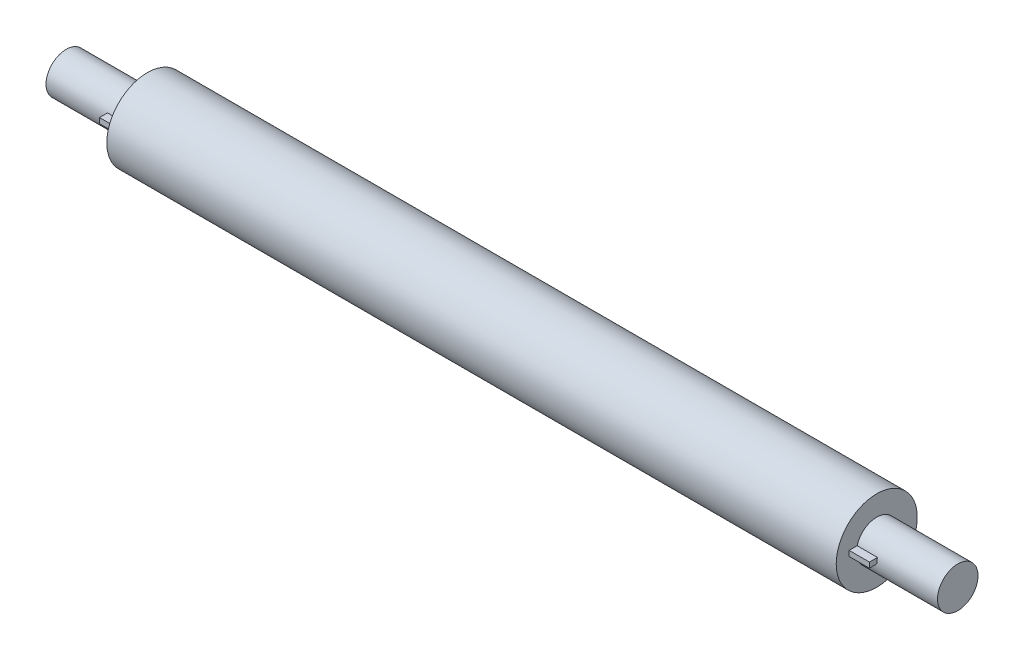
ISO-10303-21;
HEADER;
FILE_DESCRIPTION(('STEP AP214'),'2;1');
FILE_NAME('part.step','',(''),(''),'','','');
FILE_SCHEMA(('AUTOMOTIVE_DESIGN { 1 0 10303 214 1 1 1 1 }'));
ENDSEC;
DATA;
#1=APPLICATION_CONTEXT('core data for automotive mechanical design processes');
#2=APPLICATION_PROTOCOL_DEFINITION('international standard','automotive_design',2000,#1);
#3=PRODUCT_CONTEXT('',#1,'mechanical');
#4=PRODUCT('Part','Part','',(#3));
#5=PRODUCT_RELATED_PRODUCT_CATEGORY('part','',(#4));
#6=PRODUCT_DEFINITION_FORMATION('','',#4);
#7=PRODUCT_DEFINITION_CONTEXT('part definition',#1,'design');
#8=PRODUCT_DEFINITION('design','',#6,#7);
#9=PRODUCT_DEFINITION_SHAPE('','',#8);
#10=(LENGTH_UNIT() NAMED_UNIT(*) SI_UNIT(.MILLI.,.METRE.));
#11=(NAMED_UNIT(*) PLANE_ANGLE_UNIT() SI_UNIT($,.RADIAN.));
#12=(NAMED_UNIT(*) SI_UNIT($,.STERADIAN.) SOLID_ANGLE_UNIT());
#13=UNCERTAINTY_MEASURE_WITH_UNIT(LENGTH_MEASURE(1.E-05),#10,'distance_accuracy_value','');
#14=(GEOMETRIC_REPRESENTATION_CONTEXT(3) GLOBAL_UNCERTAINTY_ASSIGNED_CONTEXT((#13)) GLOBAL_UNIT_ASSIGNED_CONTEXT((#10,
#11,#12)) REPRESENTATION_CONTEXT('',''));
#15=CARTESIAN_POINT('',(0.,0.,0.));
#16=DIRECTION('',(0.,0.,1.));
#17=DIRECTION('',(1.,0.,0.));
#18=AXIS2_PLACEMENT_3D('',#15,#16,#17);
#19=CARTESIAN_POINT('',(90.,0.,5.));
#20=DIRECTION('',(1.,0.,0.));
#21=DIRECTION('',(0.,0.,-1.));
#22=AXIS2_PLACEMENT_3D('',#19,#20,#21);
#23=PLANE('',#22);
#24=CARTESIAN_POINT('',(90.,0.,0.));
#25=DIRECTION('',(-1.,0.,0.));
#26=DIRECTION('',(0.,0.,1.));
#27=AXIS2_PLACEMENT_3D('',#24,#25,#26);
#28=CIRCLE('',#27,10.);
#29=CARTESIAN_POINT('',(90.,0.,10.));
#30=VERTEX_POINT('',#29);
#31=EDGE_CURVE('E160',#30,#30,#28,.T.);
#32=ORIENTED_EDGE('',*,*,#31,.F.);
#33=EDGE_LOOP('',(#32));
#34=FACE_BOUND('',#33,.T.);
#35=DIRECTION('',(0.,-1.,0.));
#36=VECTOR('',#35,1.);
#37=CARTESIAN_POINT('',(90.,0.,6.80934893862651));
#38=LINE('',#37,#36);
#39=CARTESIAN_POINT('',(90.,1.30775575642559,6.80934893862651));
#40=VERTEX_POINT('',#39);
#41=CARTESIAN_POINT('',(90.,0.,6.80934893862651));
#42=VERTEX_POINT('',#41);
#43=EDGE_CURVE('E145',#40,#42,#38,.T.);
#44=ORIENTED_EDGE('',*,*,#43,.F.);
#45=DIRECTION('',(0.,0.,1.));
#46=VECTOR('',#45,1.);
#47=CARTESIAN_POINT('',(90.,1.30775575642559,6.80934893862651));
#48=LINE('',#47,#46);
#49=CARTESIAN_POINT('',(90.,1.30775575642559,4.82594808110652));
#50=VERTEX_POINT('',#49);
#51=EDGE_CURVE('E130',#50,#40,#48,.T.);
#52=ORIENTED_EDGE('',*,*,#51,.F.);
#53=CARTESIAN_POINT('',(90.,0.,0.));
#54=DIRECTION('',(-1.,0.,0.));
#55=DIRECTION('',(0.,0.,1.));
#56=AXIS2_PLACEMENT_3D('',#53,#54,#55);
#57=CIRCLE('',#56,5.);
#58=CARTESIAN_POINT('',(90.,0.,5.));
#59=VERTEX_POINT('',#58);
#60=EDGE_CURVE('E11',#50,#59,#57,.T.);
#61=ORIENTED_EDGE('',*,*,#60,.T.);
#62=DIRECTION('',(0.,0.,-1.));
#63=VECTOR('',#62,1.);
#64=CARTESIAN_POINT('',(90.,0.,5.));
#65=LINE('',#64,#63);
#66=EDGE_CURVE('E135',#42,#59,#65,.T.);
#67=ORIENTED_EDGE('',*,*,#66,.F.);
#68=EDGE_LOOP('',(#44,#52,#61,#67));
#69=FACE_BOUND('',#68,.T.);
#70=ADVANCED_FACE('F32',(#34,#69),#23,.T.);
#71=CARTESIAN_POINT('',(-110.,0.,0.));
#72=DIRECTION('',(-1.,0.,0.));
#73=DIRECTION('',(0.,0.,1.));
#74=AXIS2_PLACEMENT_3D('',#71,#72,#73);
#75=CYLINDRICAL_SURFACE('',#74,5.);
#76=CARTESIAN_POINT('',(110.,0.,0.));
#77=DIRECTION('',(-1.,0.,0.));
#78=DIRECTION('',(0.,0.,1.));
#79=AXIS2_PLACEMENT_3D('',#76,#77,#78);
#80=CIRCLE('',#79,5.);
#81=CARTESIAN_POINT('',(110.,0.,5.));
#82=VERTEX_POINT('',#81);
#83=EDGE_CURVE('E39',#82,#82,#80,.T.);
#84=ORIENTED_EDGE('',*,*,#83,.T.);
#85=EDGE_LOOP('',(#84));
#86=FACE_BOUND('',#85,.T.);
#87=ORIENTED_EDGE('',*,*,#60,.F.);
#88=DIRECTION('',(-1.,0.,0.));
#89=VECTOR('',#88,1.);
#90=CARTESIAN_POINT('',(95.,1.30775575642559,4.82594808110652));
#91=LINE('',#90,#89);
#92=CARTESIAN_POINT('',(95.,1.30775575642559,4.82594808110652));
#93=VERTEX_POINT('',#92);
#94=EDGE_CURVE('E157',#93,#50,#91,.T.);
#95=ORIENTED_EDGE('',*,*,#94,.F.);
#96=CARTESIAN_POINT('',(95.,0.,0.));
#97=DIRECTION('',(-1.,0.,0.));
#98=DIRECTION('',(0.,0.,-1.));
#99=AXIS2_PLACEMENT_3D('',#96,#97,#98);
#100=CIRCLE('',#99,5.);
#101=CARTESIAN_POINT('',(95.,0.,5.));
#102=VERTEX_POINT('',#101);
#103=EDGE_CURVE('E131',#102,#93,#100,.T.);
#104=ORIENTED_EDGE('',*,*,#103,.F.);
#105=DIRECTION('',(-1.,0.,0.));
#106=VECTOR('',#105,1.);
#107=CARTESIAN_POINT('',(95.,0.,5.));
#108=LINE('',#107,#106);
#109=EDGE_CURVE('E142',#102,#59,#108,.T.);
#110=ORIENTED_EDGE('',*,*,#109,.T.);
#111=EDGE_LOOP('',(#87,#95,#104,#110));
#112=FACE_BOUND('',#111,.T.);
#113=ADVANCED_FACE('F173',(#86,#112),#75,.T.);
#114=CARTESIAN_POINT('',(110.,0.,0.));
#115=DIRECTION('',(1.,0.,0.));
#116=DIRECTION('',(0.,0.,-1.));
#117=AXIS2_PLACEMENT_3D('',#114,#115,#116);
#118=PLANE('',#117);
#119=ORIENTED_EDGE('',*,*,#83,.F.);
#120=EDGE_LOOP('',(#119));
#121=FACE_BOUND('',#120,.T.);
#122=ADVANCED_FACE('F176',(#121),#118,.T.);
#123=CARTESIAN_POINT('',(-110.,0.,0.));
#124=DIRECTION('',(-1.,0.,0.));
#125=DIRECTION('',(0.,0.,1.));
#126=AXIS2_PLACEMENT_3D('',#123,#124,#125);
#127=PLANE('',#126);
#128=CARTESIAN_POINT('',(-110.,0.,0.));
#129=DIRECTION('',(-1.,0.,0.));
#130=DIRECTION('',(0.,0.,1.));
#131=AXIS2_PLACEMENT_3D('',#128,#129,#130);
#132=CIRCLE('',#131,5.);
#133=CARTESIAN_POINT('',(-110.,0.,5.));
#134=VERTEX_POINT('',#133);
#135=EDGE_CURVE('E168',#134,#134,#132,.T.);
#136=ORIENTED_EDGE('',*,*,#135,.T.);
#137=EDGE_LOOP('',(#136));
#138=FACE_BOUND('',#137,.T.);
#139=ADVANCED_FACE('F178',(#138),#127,.T.);
#140=CARTESIAN_POINT('',(-110.,0.,0.));
#141=DIRECTION('',(-1.,0.,0.));
#142=DIRECTION('',(0.,0.,1.));
#143=AXIS2_PLACEMENT_3D('',#140,#141,#142);
#144=CYLINDRICAL_SURFACE('',#143,5.);
#145=DIRECTION('',(1.,0.,0.));
#146=VECTOR('',#145,1.);
#147=CARTESIAN_POINT('',(-95.,0.,5.));
#148=LINE('',#147,#146);
#149=CARTESIAN_POINT('',(-95.,0.,5.));
#150=VERTEX_POINT('',#149);
#151=CARTESIAN_POINT('',(-90.,0.,5.));
#152=VERTEX_POINT('',#151);
#153=EDGE_CURVE('E46',#150,#152,#148,.T.);
#154=ORIENTED_EDGE('',*,*,#153,.F.);
#155=CARTESIAN_POINT('',(-95.,0.,0.));
#156=DIRECTION('',(-1.,0.,0.));
#157=DIRECTION('',(0.,0.,-1.));
#158=AXIS2_PLACEMENT_3D('',#155,#156,#157);
#159=CIRCLE('',#158,5.);
#160=CARTESIAN_POINT('',(-95.,1.30775575642559,4.82594808110653));
#161=VERTEX_POINT('',#160);
#162=EDGE_CURVE('E50',#150,#161,#159,.T.);
#163=ORIENTED_EDGE('',*,*,#162,.T.);
#164=DIRECTION('',(1.,0.,0.));
#165=VECTOR('',#164,1.);
#166=CARTESIAN_POINT('',(-95.,1.30775575642559,4.82594808110652));
#167=LINE('',#166,#165);
#168=CARTESIAN_POINT('',(-90.,1.30775575642559,4.82594808110652));
#169=VERTEX_POINT('',#168);
#170=EDGE_CURVE('E118',#161,#169,#167,.T.);
#171=ORIENTED_EDGE('',*,*,#170,.T.);
#172=CARTESIAN_POINT('',(-90.,0.,0.));
#173=DIRECTION('',(-1.,0.,0.));
#174=DIRECTION('',(0.,0.,1.));
#175=AXIS2_PLACEMENT_3D('',#172,#173,#174);
#176=CIRCLE('',#175,5.);
#177=EDGE_CURVE('E166',#169,#152,#176,.T.);
#178=ORIENTED_EDGE('',*,*,#177,.T.);
#179=EDGE_LOOP('',(#154,#163,#171,#178));
#180=FACE_BOUND('',#179,.T.);
#181=ORIENTED_EDGE('',*,*,#135,.F.);
#182=EDGE_LOOP('',(#181));
#183=FACE_BOUND('',#182,.T.);
#184=ADVANCED_FACE('F184',(#180,#183),#144,.T.);
#185=CARTESIAN_POINT('',(-90.,0.,5.));
#186=DIRECTION('',(-1.,0.,0.));
#187=DIRECTION('',(0.,0.,1.));
#188=AXIS2_PLACEMENT_3D('',#185,#186,#187);
#189=PLANE('',#188);
#190=DIRECTION('',(0.,0.,-1.));
#191=VECTOR('',#190,1.);
#192=CARTESIAN_POINT('',(-90.,0.,5.));
#193=LINE('',#192,#191);
#194=CARTESIAN_POINT('',(-90.,0.,6.80934893862651));
#195=VERTEX_POINT('',#194);
#196=EDGE_CURVE('E101',#195,#152,#193,.T.);
#197=ORIENTED_EDGE('',*,*,#196,.T.);
#198=ORIENTED_EDGE('',*,*,#177,.F.);
#199=DIRECTION('',(0.,0.,1.));
#200=VECTOR('',#199,1.);
#201=CARTESIAN_POINT('',(-90.,1.30775575642559,6.80934893862651));
#202=LINE('',#201,#200);
#203=CARTESIAN_POINT('',(-90.,1.30775575642559,6.80934893862651));
#204=VERTEX_POINT('',#203);
#205=EDGE_CURVE('E125',#169,#204,#202,.T.);
#206=ORIENTED_EDGE('',*,*,#205,.T.);
#207=DIRECTION('',(0.,-1.,0.));
#208=VECTOR('',#207,1.);
#209=CARTESIAN_POINT('',(-90.,0.,6.80934893862651));
#210=LINE('',#209,#208);
#211=EDGE_CURVE('E123',#204,#195,#210,.T.);
#212=ORIENTED_EDGE('',*,*,#211,.T.);
#213=EDGE_LOOP('',(#197,#198,#206,#212));
#214=FACE_BOUND('',#213,.T.);
#215=CARTESIAN_POINT('',(-90.,0.,0.));
#216=DIRECTION('',(-1.,0.,0.));
#217=DIRECTION('',(0.,0.,1.));
#218=AXIS2_PLACEMENT_3D('',#215,#216,#217);
#219=CIRCLE('',#218,10.);
#220=CARTESIAN_POINT('',(-90.,0.,10.));
#221=VERTEX_POINT('',#220);
#222=EDGE_CURVE('E163',#221,#221,#219,.T.);
#223=ORIENTED_EDGE('',*,*,#222,.T.);
#224=EDGE_LOOP('',(#223));
#225=FACE_BOUND('',#224,.T.);
#226=ADVANCED_FACE('F223',(#214,#225),#189,.T.);
#227=CARTESIAN_POINT('',(-110.,0.,0.));
#228=DIRECTION('',(-1.,0.,0.));
#229=DIRECTION('',(0.,0.,1.));
#230=AXIS2_PLACEMENT_3D('',#227,#228,#229);
#231=CYLINDRICAL_SURFACE('',#230,10.);
#232=ORIENTED_EDGE('',*,*,#31,.T.);
#233=EDGE_LOOP('',(#232));
#234=FACE_BOUND('',#233,.T.);
#235=ORIENTED_EDGE('',*,*,#222,.F.);
#236=EDGE_LOOP('',(#235));
#237=FACE_BOUND('',#236,.T.);
#238=ADVANCED_FACE('F220',(#234,#237),#231,.T.);
#239=CARTESIAN_POINT('',(95.,1.30775575642559,6.80934893862651));
#240=DIRECTION('',(0.,-1.,0.));
#241=DIRECTION('',(0.,0.,-1.));
#242=AXIS2_PLACEMENT_3D('',#239,#240,#241);
#243=PLANE('',#242);
#244=ORIENTED_EDGE('',*,*,#51,.T.);
#245=DIRECTION('',(-1.,0.,0.));
#246=VECTOR('',#245,1.);
#247=CARTESIAN_POINT('',(95.,1.30775575642559,6.80934893862651));
#248=LINE('',#247,#246);
#249=CARTESIAN_POINT('',(95.,1.30775575642559,6.80934893862651));
#250=VERTEX_POINT('',#249);
#251=EDGE_CURVE('E154',#250,#40,#248,.T.);
#252=ORIENTED_EDGE('',*,*,#251,.F.);
#253=DIRECTION('',(0.,0.,1.));
#254=VECTOR('',#253,1.);
#255=CARTESIAN_POINT('',(95.,1.30775575642559,6.80934893862651));
#256=LINE('',#255,#254);
#257=EDGE_CURVE('E134',#93,#250,#256,.T.);
#258=ORIENTED_EDGE('',*,*,#257,.F.);
#259=ORIENTED_EDGE('',*,*,#94,.T.);
#260=EDGE_LOOP('',(#244,#252,#258,#259));
#261=FACE_BOUND('',#260,.T.);
#262=ADVANCED_FACE('F198',(#261),#243,.F.);
#263=CARTESIAN_POINT('',(95.,0.,6.80934893862651));
#264=DIRECTION('',(0.,0.,-1.));
#265=DIRECTION('',(-1.,0.,0.));
#266=AXIS2_PLACEMENT_3D('',#263,#264,#265);
#267=PLANE('',#266);
#268=ORIENTED_EDGE('',*,*,#43,.T.);
#269=DIRECTION('',(-1.,0.,0.));
#270=VECTOR('',#269,1.);
#271=CARTESIAN_POINT('',(95.,0.,6.80934893862651));
#272=LINE('',#271,#270);
#273=CARTESIAN_POINT('',(95.,0.,6.80934893862651));
#274=VERTEX_POINT('',#273);
#275=EDGE_CURVE('E151',#274,#42,#272,.T.);
#276=ORIENTED_EDGE('',*,*,#275,.F.);
#277=DIRECTION('',(0.,-1.,0.));
#278=VECTOR('',#277,1.);
#279=CARTESIAN_POINT('',(95.,0.,6.80934893862651));
#280=LINE('',#279,#278);
#281=EDGE_CURVE('E137',#250,#274,#280,.T.);
#282=ORIENTED_EDGE('',*,*,#281,.F.);
#283=ORIENTED_EDGE('',*,*,#251,.T.);
#284=EDGE_LOOP('',(#268,#276,#282,#283));
#285=FACE_BOUND('',#284,.T.);
#286=ADVANCED_FACE('F201',(#285),#267,.F.);
#287=CARTESIAN_POINT('',(95.,0.,5.));
#288=DIRECTION('',(0.,1.,0.));
#289=DIRECTION('',(0.,0.,1.));
#290=AXIS2_PLACEMENT_3D('',#287,#288,#289);
#291=PLANE('',#290);
#292=ORIENTED_EDGE('',*,*,#66,.T.);
#293=ORIENTED_EDGE('',*,*,#109,.F.);
#294=DIRECTION('',(0.,0.,-1.));
#295=VECTOR('',#294,1.);
#296=CARTESIAN_POINT('',(95.,0.,5.));
#297=LINE('',#296,#295);
#298=EDGE_CURVE('E139',#274,#102,#297,.T.);
#299=ORIENTED_EDGE('',*,*,#298,.F.);
#300=ORIENTED_EDGE('',*,*,#275,.T.);
#301=EDGE_LOOP('',(#292,#293,#299,#300));
#302=FACE_BOUND('',#301,.T.);
#303=ADVANCED_FACE('F207',(#302),#291,.F.);
#304=CARTESIAN_POINT('',(95.,0.,0.));
#305=DIRECTION('',(1.,0.,0.));
#306=DIRECTION('',(0.,0.,-1.));
#307=AXIS2_PLACEMENT_3D('',#304,#305,#306);
#308=PLANE('',#307);
#309=ORIENTED_EDGE('',*,*,#103,.T.);
#310=ORIENTED_EDGE('',*,*,#257,.T.);
#311=ORIENTED_EDGE('',*,*,#281,.T.);
#312=ORIENTED_EDGE('',*,*,#298,.T.);
#313=EDGE_LOOP('',(#309,#310,#311,#312));
#314=FACE_BOUND('',#313,.T.);
#315=ADVANCED_FACE('F204',(#314),#308,.T.);
#316=CARTESIAN_POINT('',(-95.,0.,5.));
#317=DIRECTION('',(0.,-1.,0.));
#318=DIRECTION('',(0.,0.,-1.));
#319=AXIS2_PLACEMENT_3D('',#316,#317,#318);
#320=PLANE('',#319);
#321=ORIENTED_EDGE('',*,*,#196,.F.);
#322=DIRECTION('',(1.,0.,0.));
#323=VECTOR('',#322,1.);
#324=CARTESIAN_POINT('',(-95.,0.,6.80934893862651));
#325=LINE('',#324,#323);
#326=CARTESIAN_POINT('',(-95.,0.,6.80934893862651));
#327=VERTEX_POINT('',#326);
#328=EDGE_CURVE('E97',#327,#195,#325,.T.);
#329=ORIENTED_EDGE('',*,*,#328,.F.);
#330=DIRECTION('',(0.,0.,-1.));
#331=VECTOR('',#330,1.);
#332=CARTESIAN_POINT('',(-95.,0.,5.));
#333=LINE('',#332,#331);
#334=EDGE_CURVE('E100',#327,#150,#333,.T.);
#335=ORIENTED_EDGE('',*,*,#334,.T.);
#336=ORIENTED_EDGE('',*,*,#153,.T.);
#337=EDGE_LOOP('',(#321,#329,#335,#336));
#338=FACE_BOUND('',#337,.T.);
#339=ADVANCED_FACE('F99',(#338),#320,.T.);
#340=CARTESIAN_POINT('',(-95.,0.,6.80934893862651));
#341=DIRECTION('',(0.,0.,1.));
#342=DIRECTION('',(1.,0.,0.));
#343=AXIS2_PLACEMENT_3D('',#340,#341,#342);
#344=PLANE('',#343);
#345=ORIENTED_EDGE('',*,*,#211,.F.);
#346=DIRECTION('',(1.,0.,0.));
#347=VECTOR('',#346,1.);
#348=CARTESIAN_POINT('',(-95.,1.30775575642559,6.80934893862651));
#349=LINE('',#348,#347);
#350=CARTESIAN_POINT('',(-95.,1.30775575642559,6.80934893862651));
#351=VERTEX_POINT('',#350);
#352=EDGE_CURVE('E105',#351,#204,#349,.T.);
#353=ORIENTED_EDGE('',*,*,#352,.F.);
#354=DIRECTION('',(0.,-1.,0.));
#355=VECTOR('',#354,1.);
#356=CARTESIAN_POINT('',(-95.,0.,6.80934893862651));
#357=LINE('',#356,#355);
#358=EDGE_CURVE('E111',#351,#327,#357,.T.);
#359=ORIENTED_EDGE('',*,*,#358,.T.);
#360=ORIENTED_EDGE('',*,*,#328,.T.);
#361=EDGE_LOOP('',(#345,#353,#359,#360));
#362=FACE_BOUND('',#361,.T.);
#363=ADVANCED_FACE('F114',(#362),#344,.T.);
#364=CARTESIAN_POINT('',(-95.,1.30775575642559,6.80934893862651));
#365=DIRECTION('',(0.,1.,0.));
#366=DIRECTION('',(0.,0.,1.));
#367=AXIS2_PLACEMENT_3D('',#364,#365,#366);
#368=PLANE('',#367);
#369=ORIENTED_EDGE('',*,*,#205,.F.);
#370=ORIENTED_EDGE('',*,*,#170,.F.);
#371=DIRECTION('',(0.,0.,1.));
#372=VECTOR('',#371,1.);
#373=CARTESIAN_POINT('',(-95.,1.30775575642559,6.80934893862651));
#374=LINE('',#373,#372);
#375=EDGE_CURVE('E116',#161,#351,#374,.T.);
#376=ORIENTED_EDGE('',*,*,#375,.T.);
#377=ORIENTED_EDGE('',*,*,#352,.T.);
#378=EDGE_LOOP('',(#369,#370,#376,#377));
#379=FACE_BOUND('',#378,.T.);
#380=ADVANCED_FACE('F275',(#379),#368,.T.);
#381=CARTESIAN_POINT('',(-95.,0.,0.));
#382=DIRECTION('',(-1.,0.,0.));
#383=DIRECTION('',(0.,0.,-1.));
#384=AXIS2_PLACEMENT_3D('',#381,#382,#383);
#385=PLANE('',#384);
#386=ORIENTED_EDGE('',*,*,#162,.F.);
#387=ORIENTED_EDGE('',*,*,#334,.F.);
#388=ORIENTED_EDGE('',*,*,#358,.F.);
#389=ORIENTED_EDGE('',*,*,#375,.F.);
#390=EDGE_LOOP('',(#386,#387,#388,#389));
#391=FACE_BOUND('',#390,.T.);
#392=ADVANCED_FACE('F109',(#391),#385,.T.);
#393=CLOSED_SHELL('',(#70,#113,#122,#139,#184,#226,#238,#262,#286,#303,#315,#339,#363,#380,#392));
#394=MANIFOLD_SOLID_BREP('B2',#393);
#395=ADVANCED_BREP_SHAPE_REPRESENTATION('',(#18,#394),#14);
#396=SHAPE_DEFINITION_REPRESENTATION(#9,#395);
ENDSEC;
END-ISO-10303-21;
